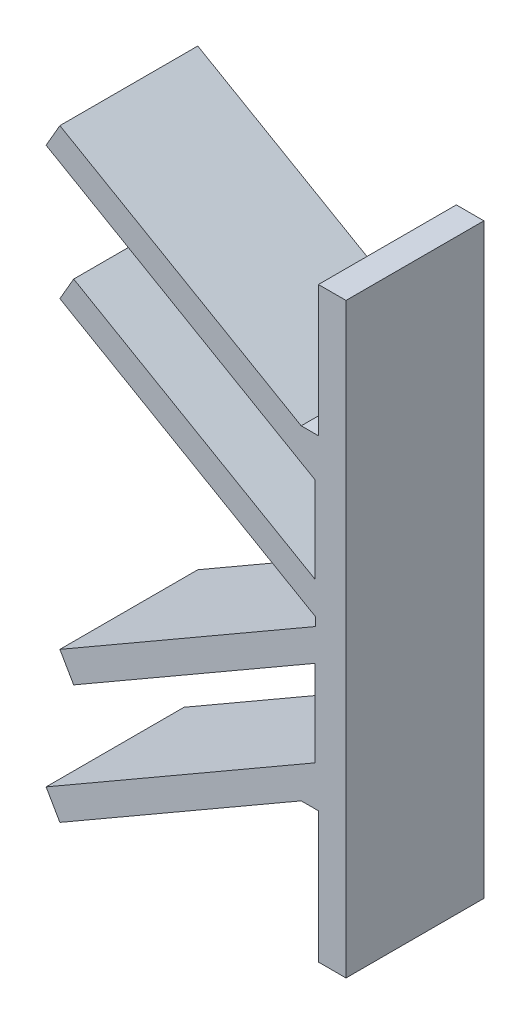
ISO-10303-21;
HEADER;
FILE_DESCRIPTION(('STEP AP214'),'2;1');
FILE_NAME('part.step','',(''),(''),'','','');
FILE_SCHEMA(('AUTOMOTIVE_DESIGN { 1 0 10303 214 1 1 1 1 }'));
ENDSEC;
DATA;
#1=APPLICATION_CONTEXT('core data for automotive mechanical design processes');
#2=APPLICATION_PROTOCOL_DEFINITION('international standard','automotive_design',2000,#1);
#3=PRODUCT_CONTEXT('',#1,'mechanical');
#4=PRODUCT('Part','Part','',(#3));
#5=PRODUCT_RELATED_PRODUCT_CATEGORY('part','',(#4));
#6=PRODUCT_DEFINITION_FORMATION('','',#4);
#7=PRODUCT_DEFINITION_CONTEXT('part definition',#1,'design');
#8=PRODUCT_DEFINITION('design','',#6,#7);
#9=PRODUCT_DEFINITION_SHAPE('','',#8);
#10=(LENGTH_UNIT() NAMED_UNIT(*) SI_UNIT(.MILLI.,.METRE.));
#11=(NAMED_UNIT(*) PLANE_ANGLE_UNIT() SI_UNIT($,.RADIAN.));
#12=(NAMED_UNIT(*) SI_UNIT($,.STERADIAN.) SOLID_ANGLE_UNIT());
#13=UNCERTAINTY_MEASURE_WITH_UNIT(LENGTH_MEASURE(1.E-05),#10,'distance_accuracy_value','');
#14=(GEOMETRIC_REPRESENTATION_CONTEXT(3) GLOBAL_UNCERTAINTY_ASSIGNED_CONTEXT((#13)) GLOBAL_UNIT_ASSIGNED_CONTEXT((#10,
#11,#12)) REPRESENTATION_CONTEXT('',''));
#15=CARTESIAN_POINT('',(0.,0.,0.));
#16=DIRECTION('',(0.,0.,1.));
#17=DIRECTION('',(1.,0.,0.));
#18=AXIS2_PLACEMENT_3D('',#15,#16,#17);
#19=CARTESIAN_POINT('',(1.8,17.444065895807,8.));
#20=DIRECTION('',(-1.,0.,0.));
#21=DIRECTION('',(0.,0.,1.));
#22=AXIS2_PLACEMENT_3D('',#19,#20,#21);
#23=PLANE('',#22);
#24=DIRECTION('',(0.,1.,0.));
#25=VECTOR('',#24,1.);
#26=CARTESIAN_POINT('',(1.8,17.444065895807,0.));
#27=LINE('',#26,#25);
#28=CARTESIAN_POINT('',(1.8,-16.6,0.));
#29=VERTEX_POINT('',#28);
#30=CARTESIAN_POINT('',(1.8,17.444065895807,0.));
#31=VERTEX_POINT('',#30);
#32=EDGE_CURVE('E131',#29,#31,#27,.T.);
#33=ORIENTED_EDGE('',*,*,#32,.T.);
#34=DIRECTION('',(0.,0.,-1.));
#35=VECTOR('',#34,1.);
#36=CARTESIAN_POINT('',(1.8,17.444065895807,8.));
#37=LINE('',#36,#35);
#38=CARTESIAN_POINT('',(1.8,17.444065895807,8.));
#39=VERTEX_POINT('',#38);
#40=EDGE_CURVE('E11',#39,#31,#37,.T.);
#41=ORIENTED_EDGE('',*,*,#40,.F.);
#42=DIRECTION('',(0.,1.,0.));
#43=VECTOR('',#42,1.);
#44=CARTESIAN_POINT('',(1.8,-16.6,8.));
#45=LINE('',#44,#43);
#46=CARTESIAN_POINT('',(1.8,-16.6,8.));
#47=VERTEX_POINT('',#46);
#48=EDGE_CURVE('E139',#47,#39,#45,.T.);
#49=ORIENTED_EDGE('',*,*,#48,.F.);
#50=DIRECTION('',(0.,0.,-1.));
#51=VECTOR('',#50,1.);
#52=CARTESIAN_POINT('',(1.8,-16.6,8.));
#53=LINE('',#52,#51);
#54=EDGE_CURVE('E214',#47,#29,#53,.T.);
#55=ORIENTED_EDGE('',*,*,#54,.T.);
#56=EDGE_LOOP('',(#33,#41,#49,#55));
#57=FACE_BOUND('',#56,.T.);
#58=ADVANCED_FACE('F39',(#57),#23,.F.);
#59=CARTESIAN_POINT('',(0.199999999999989,17.444065895807,8.));
#60=DIRECTION('',(0.,-1.,0.));
#61=DIRECTION('',(0.,0.,-1.));
#62=AXIS2_PLACEMENT_3D('',#59,#60,#61);
#63=PLANE('',#62);
#64=DIRECTION('',(-1.,0.,0.));
#65=VECTOR('',#64,1.);
#66=CARTESIAN_POINT('',(0.199999999999989,17.444065895807,0.));
#67=LINE('',#66,#65);
#68=CARTESIAN_POINT('',(0.199999999999989,17.444065895807,0.));
#69=VERTEX_POINT('',#68);
#70=EDGE_CURVE('E219',#31,#69,#67,.T.);
#71=ORIENTED_EDGE('',*,*,#70,.T.);
#72=DIRECTION('',(0.,0.,-1.));
#73=VECTOR('',#72,1.);
#74=CARTESIAN_POINT('',(0.199999999999989,17.444065895807,8.));
#75=LINE('',#74,#73);
#76=CARTESIAN_POINT('',(0.199999999999989,17.444065895807,8.));
#77=VERTEX_POINT('',#76);
#78=EDGE_CURVE('E50',#77,#69,#75,.T.);
#79=ORIENTED_EDGE('',*,*,#78,.F.);
#80=DIRECTION('',(-1.,0.,0.));
#81=VECTOR('',#80,1.);
#82=CARTESIAN_POINT('',(0.199999999999989,17.444065895807,8.));
#83=LINE('',#82,#81);
#84=EDGE_CURVE('E379',#39,#77,#83,.T.);
#85=ORIENTED_EDGE('',*,*,#84,.F.);
#86=ORIENTED_EDGE('',*,*,#40,.T.);
#87=EDGE_LOOP('',(#71,#79,#85,#86));
#88=FACE_BOUND('',#87,.T.);
#89=ADVANCED_FACE('F382',(#88),#63,.F.);
#90=CARTESIAN_POINT('',(0.199999999999989,17.444065895807,8.));
#91=DIRECTION('',(1.,0.,0.));
#92=DIRECTION('',(0.,1.,0.));
#93=AXIS2_PLACEMENT_3D('',#90,#91,#92);
#94=PLANE('',#93);
#95=DIRECTION('',(0.,-1.,0.));
#96=VECTOR('',#95,1.);
#97=CARTESIAN_POINT('',(0.199999999999989,17.444065895807,0.));
#98=LINE('',#97,#96);
#99=CARTESIAN_POINT('',(0.199999999999982,9.84406589580699,0.));
#100=VERTEX_POINT('',#99);
#101=EDGE_CURVE('E225',#69,#100,#98,.T.);
#102=ORIENTED_EDGE('',*,*,#101,.T.);
#103=DIRECTION('',(0.,0.,-1.));
#104=VECTOR('',#103,1.);
#105=CARTESIAN_POINT('',(0.199999999999982,9.84406589580699,8.));
#106=LINE('',#105,#104);
#107=CARTESIAN_POINT('',(0.199999999999982,9.84406589580699,8.));
#108=VERTEX_POINT('',#107);
#109=EDGE_CURVE('E313',#108,#100,#106,.T.);
#110=ORIENTED_EDGE('',*,*,#109,.F.);
#111=DIRECTION('',(0.,-1.,0.));
#112=VECTOR('',#111,1.);
#113=CARTESIAN_POINT('',(0.199999999999989,17.444065895807,8.));
#114=LINE('',#113,#112);
#115=EDGE_CURVE('E319',#77,#108,#114,.T.);
#116=ORIENTED_EDGE('',*,*,#115,.F.);
#117=ORIENTED_EDGE('',*,*,#78,.T.);
#118=EDGE_LOOP('',(#102,#110,#116,#117));
#119=FACE_BOUND('',#118,.T.);
#120=ADVANCED_FACE('F318',(#119),#94,.F.);
#121=CARTESIAN_POINT('',(0.199999999999982,9.84406589580699,8.));
#122=DIRECTION('',(0.,-1.,0.));
#123=DIRECTION('',(0.,0.,-1.));
#124=AXIS2_PLACEMENT_3D('',#121,#122,#123);
#125=PLANE('',#124);
#126=DIRECTION('',(-1.,0.,0.));
#127=VECTOR('',#126,1.);
#128=CARTESIAN_POINT('',(0.199999999999982,9.84406589580699,0.));
#129=LINE('',#128,#127);
#130=CARTESIAN_POINT('',(-0.800000000000016,9.84406589580699,0.));
#131=VERTEX_POINT('',#130);
#132=EDGE_CURVE('E221',#100,#131,#129,.T.);
#133=ORIENTED_EDGE('',*,*,#132,.T.);
#134=DIRECTION('',(0.,0.,-1.));
#135=VECTOR('',#134,1.);
#136=CARTESIAN_POINT('',(-0.800000000000016,9.84406589580699,8.));
#137=LINE('',#136,#135);
#138=CARTESIAN_POINT('',(-0.800000000000016,9.84406589580699,8.));
#139=VERTEX_POINT('',#138);
#140=EDGE_CURVE('E306',#139,#131,#137,.T.);
#141=ORIENTED_EDGE('',*,*,#140,.F.);
#142=DIRECTION('',(-1.,0.,0.));
#143=VECTOR('',#142,1.);
#144=CARTESIAN_POINT('',(0.199999999999982,9.84406589580699,8.));
#145=LINE('',#144,#143);
#146=EDGE_CURVE('E336',#108,#139,#145,.T.);
#147=ORIENTED_EDGE('',*,*,#146,.F.);
#148=ORIENTED_EDGE('',*,*,#109,.T.);
#149=EDGE_LOOP('',(#133,#141,#147,#148));
#150=FACE_BOUND('',#149,.T.);
#151=ADVANCED_FACE('F328',(#150),#125,.F.);
#152=CARTESIAN_POINT('',(-0.800000000000016,9.84406589580699,8.));
#153=DIRECTION('',(-0.499999999999998,-0.86602540378444,0.));
#154=DIRECTION('',(0.86602540378444,-0.499999999999998,0.));
#155=AXIS2_PLACEMENT_3D('',#152,#153,#154);
#156=PLANE('',#155);
#157=DIRECTION('',(-0.86602540378444,0.499999999999998,0.));
#158=VECTOR('',#157,1.);
#159=CARTESIAN_POINT('',(-0.800000000000016,9.84406589580699,0.));
#160=LINE('',#159,#158);
#161=CARTESIAN_POINT('',(-14.8,17.9269696644617,0.));
#162=VERTEX_POINT('',#161);
#163=EDGE_CURVE('E228',#131,#162,#160,.T.);
#164=ORIENTED_EDGE('',*,*,#163,.T.);
#165=DIRECTION('',(0.,0.,-1.));
#166=VECTOR('',#165,1.);
#167=CARTESIAN_POINT('',(-14.8,17.9269696644617,8.));
#168=LINE('',#167,#166);
#169=CARTESIAN_POINT('',(-14.8,17.9269696644617,8.));
#170=VERTEX_POINT('',#169);
#171=EDGE_CURVE('E302',#170,#162,#168,.T.);
#172=ORIENTED_EDGE('',*,*,#171,.F.);
#173=DIRECTION('',(-0.86602540378444,0.499999999999998,0.));
#174=VECTOR('',#173,1.);
#175=CARTESIAN_POINT('',(-0.800000000000016,9.84406589580699,8.));
#176=LINE('',#175,#174);
#177=EDGE_CURVE('E333',#139,#170,#176,.T.);
#178=ORIENTED_EDGE('',*,*,#177,.F.);
#179=ORIENTED_EDGE('',*,*,#140,.T.);
#180=EDGE_LOOP('',(#164,#172,#178,#179));
#181=FACE_BOUND('',#180,.T.);
#182=ADVANCED_FACE('F334',(#181),#156,.F.);
#183=CARTESIAN_POINT('',(-14.8,17.9269696644617,8.));
#184=DIRECTION('',(0.866025403784441,-0.499999999999995,0.));
#185=DIRECTION('',(0.499999999999995,0.866025403784441,0.));
#186=AXIS2_PLACEMENT_3D('',#183,#184,#185);
#187=PLANE('',#186);
#188=DIRECTION('',(-0.499999999999995,-0.866025403784441,0.));
#189=VECTOR('',#188,1.);
#190=CARTESIAN_POINT('',(-14.8,17.9269696644617,0.));
#191=LINE('',#190,#189);
#192=CARTESIAN_POINT('',(-15.6,16.5413290184066,0.));
#193=VERTEX_POINT('',#192);
#194=EDGE_CURVE('E226',#162,#193,#191,.T.);
#195=ORIENTED_EDGE('',*,*,#194,.T.);
#196=DIRECTION('',(0.,0.,-1.));
#197=VECTOR('',#196,1.);
#198=CARTESIAN_POINT('',(-15.6,16.5413290184066,8.));
#199=LINE('',#198,#197);
#200=CARTESIAN_POINT('',(-15.6,16.5413290184066,8.));
#201=VERTEX_POINT('',#200);
#202=EDGE_CURVE('E305',#201,#193,#199,.T.);
#203=ORIENTED_EDGE('',*,*,#202,.F.);
#204=DIRECTION('',(-0.499999999999995,-0.866025403784441,0.));
#205=VECTOR('',#204,1.);
#206=CARTESIAN_POINT('',(-14.8,17.9269696644617,8.));
#207=LINE('',#206,#205);
#208=EDGE_CURVE('E340',#170,#201,#207,.T.);
#209=ORIENTED_EDGE('',*,*,#208,.F.);
#210=ORIENTED_EDGE('',*,*,#171,.T.);
#211=EDGE_LOOP('',(#195,#203,#209,#210));
#212=FACE_BOUND('',#211,.T.);
#213=ADVANCED_FACE('F394',(#212),#187,.F.);
#214=CARTESIAN_POINT('',(-15.6,16.5413290184066,8.));
#215=DIRECTION('',(0.499999999999999,0.866025403784439,0.));
#216=DIRECTION('',(-0.86602540378444,0.499999999999999,0.));
#217=AXIS2_PLACEMENT_3D('',#214,#215,#216);
#218=PLANE('',#217);
#219=DIRECTION('',(0.86602540378444,-0.499999999999999,0.));
#220=VECTOR('',#219,1.);
#221=CARTESIAN_POINT('',(-15.6,16.5413290184066,0.));
#222=LINE('',#221,#220);
#223=CARTESIAN_POINT('',(0.,7.53466481904848,0.));
#224=VERTEX_POINT('',#223);
#225=EDGE_CURVE('E229',#193,#224,#222,.T.);
#226=ORIENTED_EDGE('',*,*,#225,.T.);
#227=DIRECTION('',(0.,0.,-1.));
#228=VECTOR('',#227,1.);
#229=CARTESIAN_POINT('',(0.,7.53466481904848,8.));
#230=LINE('',#229,#228);
#231=CARTESIAN_POINT('',(0.,7.53466481904848,8.));
#232=VERTEX_POINT('',#231);
#233=EDGE_CURVE('E297',#232,#224,#230,.T.);
#234=ORIENTED_EDGE('',*,*,#233,.F.);
#235=DIRECTION('',(0.86602540378444,-0.499999999999999,0.));
#236=VECTOR('',#235,1.);
#237=CARTESIAN_POINT('',(-15.6,16.5413290184066,8.));
#238=LINE('',#237,#236);
#239=EDGE_CURVE('E339',#201,#232,#238,.T.);
#240=ORIENTED_EDGE('',*,*,#239,.F.);
#241=ORIENTED_EDGE('',*,*,#202,.T.);
#242=EDGE_LOOP('',(#226,#234,#240,#241));
#243=FACE_BOUND('',#242,.T.);
#244=ADVANCED_FACE('F396',(#243),#218,.F.);
#245=CARTESIAN_POINT('',(0.,7.53466481904848,8.));
#246=DIRECTION('',(1.,0.,0.));
#247=DIRECTION('',(0.,1.,0.));
#248=AXIS2_PLACEMENT_3D('',#245,#246,#247);
#249=PLANE('',#248);
#250=DIRECTION('',(0.,-1.,0.));
#251=VECTOR('',#250,1.);
#252=CARTESIAN_POINT('',(0.,7.53466481904848,0.));
#253=LINE('',#252,#251);
#254=CARTESIAN_POINT('',(0.,2.53466481904848,0.));
#255=VERTEX_POINT('',#254);
#256=EDGE_CURVE('E235',#224,#255,#253,.T.);
#257=ORIENTED_EDGE('',*,*,#256,.T.);
#258=DIRECTION('',(0.,0.,-1.));
#259=VECTOR('',#258,1.);
#260=CARTESIAN_POINT('',(0.,2.53466481904848,8.));
#261=LINE('',#260,#259);
#262=CARTESIAN_POINT('',(0.,2.53466481904848,8.));
#263=VERTEX_POINT('',#262);
#264=EDGE_CURVE('E298',#263,#255,#261,.T.);
#265=ORIENTED_EDGE('',*,*,#264,.F.);
#266=DIRECTION('',(0.,-1.,0.));
#267=VECTOR('',#266,1.);
#268=CARTESIAN_POINT('',(0.,7.53466481904848,8.));
#269=LINE('',#268,#267);
#270=EDGE_CURVE('E347',#232,#263,#269,.T.);
#271=ORIENTED_EDGE('',*,*,#270,.F.);
#272=ORIENTED_EDGE('',*,*,#233,.T.);
#273=EDGE_LOOP('',(#257,#265,#271,#272));
#274=FACE_BOUND('',#273,.T.);
#275=ADVANCED_FACE('F405',(#274),#249,.F.);
#276=CARTESIAN_POINT('',(0.,2.53466481904848,8.));
#277=DIRECTION('',(-0.499999999999999,-0.866025403784439,0.));
#278=DIRECTION('',(0.866025403784439,-0.499999999999999,0.));
#279=AXIS2_PLACEMENT_3D('',#276,#277,#278);
#280=PLANE('',#279);
#281=DIRECTION('',(-0.866025403784439,0.499999999999999,0.));
#282=VECTOR('',#281,1.);
#283=CARTESIAN_POINT('',(0.,2.53466481904848,0.));
#284=LINE('',#283,#282);
#285=CARTESIAN_POINT('',(-14.,10.6175685877032,0.));
#286=VERTEX_POINT('',#285);
#287=EDGE_CURVE('E234',#255,#286,#284,.T.);
#288=ORIENTED_EDGE('',*,*,#287,.T.);
#289=DIRECTION('',(0.,0.,-1.));
#290=VECTOR('',#289,1.);
#291=CARTESIAN_POINT('',(-14.,10.6175685877032,8.));
#292=LINE('',#291,#290);
#293=CARTESIAN_POINT('',(-14.,10.6175685877032,8.));
#294=VERTEX_POINT('',#293);
#295=EDGE_CURVE('E291',#294,#286,#292,.T.);
#296=ORIENTED_EDGE('',*,*,#295,.F.);
#297=DIRECTION('',(-0.866025403784439,0.499999999999999,0.));
#298=VECTOR('',#297,1.);
#299=CARTESIAN_POINT('',(0.,2.53466481904848,8.));
#300=LINE('',#299,#298);
#301=EDGE_CURVE('E346',#263,#294,#300,.T.);
#302=ORIENTED_EDGE('',*,*,#301,.F.);
#303=ORIENTED_EDGE('',*,*,#264,.T.);
#304=EDGE_LOOP('',(#288,#296,#302,#303));
#305=FACE_BOUND('',#304,.T.);
#306=ADVANCED_FACE('F408',(#305),#280,.F.);
#307=CARTESIAN_POINT('',(-14.,10.6175685877032,8.));
#308=DIRECTION('',(0.866025403784439,-0.499999999999999,0.));
#309=DIRECTION('',(0.499999999999999,0.866025403784439,0.));
#310=AXIS2_PLACEMENT_3D('',#307,#308,#309);
#311=PLANE('',#310);
#312=DIRECTION('',(-0.499999999999999,-0.866025403784439,0.));
#313=VECTOR('',#312,1.);
#314=CARTESIAN_POINT('',(-14.,10.6175685877032,0.));
#315=LINE('',#314,#313);
#316=CARTESIAN_POINT('',(-14.8,9.23192794164811,0.));
#317=VERTEX_POINT('',#316);
#318=EDGE_CURVE('E237',#286,#317,#315,.T.);
#319=ORIENTED_EDGE('',*,*,#318,.T.);
#320=DIRECTION('',(0.,0.,-1.));
#321=VECTOR('',#320,1.);
#322=CARTESIAN_POINT('',(-14.8,9.23192794164811,8.));
#323=LINE('',#322,#321);
#324=CARTESIAN_POINT('',(-14.8,9.23192794164811,8.));
#325=VERTEX_POINT('',#324);
#326=EDGE_CURVE('E287',#325,#317,#323,.T.);
#327=ORIENTED_EDGE('',*,*,#326,.F.);
#328=DIRECTION('',(-0.499999999999999,-0.866025403784439,0.));
#329=VECTOR('',#328,1.);
#330=CARTESIAN_POINT('',(-14.,10.6175685877032,8.));
#331=LINE('',#330,#329);
#332=EDGE_CURVE('E348',#294,#325,#331,.T.);
#333=ORIENTED_EDGE('',*,*,#332,.F.);
#334=ORIENTED_EDGE('',*,*,#295,.T.);
#335=EDGE_LOOP('',(#319,#327,#333,#334));
#336=FACE_BOUND('',#335,.T.);
#337=ADVANCED_FACE('F409',(#336),#311,.F.);
#338=CARTESIAN_POINT('',(-14.0168684713036,8.77978674274434,8.));
#339=DIRECTION('',(0.499999999999999,0.866025403784439,0.));
#340=DIRECTION('',(-0.866025403784439,0.499999999999999,0.));
#341=AXIS2_PLACEMENT_3D('',#338,#339,#340);
#342=PLANE('',#341);
#343=DIRECTION('',(0.866025403784439,-0.499999999999999,0.));
#344=VECTOR('',#343,1.);
#345=CARTESIAN_POINT('',(-14.0168684713036,8.77978674274434,0.));
#346=LINE('',#345,#344);
#347=CARTESIAN_POINT('',(0.0261730366202076,0.672032947903492,0.));
#348=VERTEX_POINT('',#347);
#349=EDGE_CURVE('E239',#317,#348,#346,.T.);
#350=ORIENTED_EDGE('',*,*,#349,.T.);
#351=DIRECTION('',(0.,0.,-1.));
#352=VECTOR('',#351,1.);
#353=CARTESIAN_POINT('',(0.0261730366202076,0.672032947903492,8.));
#354=LINE('',#353,#352);
#355=CARTESIAN_POINT('',(0.0261730366202076,0.672032947903492,8.));
#356=VERTEX_POINT('',#355);
#357=EDGE_CURVE('E290',#356,#348,#354,.T.);
#358=ORIENTED_EDGE('',*,*,#357,.F.);
#359=DIRECTION('',(0.866025403784441,-0.499999999999996,0.));
#360=VECTOR('',#359,1.);
#361=CARTESIAN_POINT('',(-14.8,9.23192794164811,8.));
#362=LINE('',#361,#360);
#363=EDGE_CURVE('E355',#325,#356,#362,.T.);
#364=ORIENTED_EDGE('',*,*,#363,.F.);
#365=ORIENTED_EDGE('',*,*,#326,.T.);
#366=EDGE_LOOP('',(#350,#358,#364,#365));
#367=FACE_BOUND('',#366,.T.);
#368=ADVANCED_FACE('F414',(#367),#342,.F.);
#369=CARTESIAN_POINT('',(0.0261730366202077,0.172032947903492,8.));
#370=DIRECTION('',(1.,0.,0.));
#371=DIRECTION('',(0.,1.,0.));
#372=AXIS2_PLACEMENT_3D('',#369,#370,#371);
#373=PLANE('',#372);
#374=DIRECTION('',(0.,-1.,0.));
#375=VECTOR('',#374,1.);
#376=CARTESIAN_POINT('',(0.0261730366202077,0.172032947903492,0.));
#377=LINE('',#376,#375);
#378=CARTESIAN_POINT('',(0.0261730366202077,0.172032947903492,0.));
#379=VERTEX_POINT('',#378);
#380=EDGE_CURVE('E243',#348,#379,#377,.T.);
#381=ORIENTED_EDGE('',*,*,#380,.T.);
#382=DIRECTION('',(0.,0.,-1.));
#383=VECTOR('',#382,1.);
#384=CARTESIAN_POINT('',(0.0261730366202077,0.172032947903492,8.));
#385=LINE('',#384,#383);
#386=CARTESIAN_POINT('',(0.0261730366202077,0.172032947903492,8.));
#387=VERTEX_POINT('',#386);
#388=EDGE_CURVE('E282',#387,#379,#385,.T.);
#389=ORIENTED_EDGE('',*,*,#388,.F.);
#390=DIRECTION('',(0.,-1.,0.));
#391=VECTOR('',#390,1.);
#392=CARTESIAN_POINT('',(0.0261730366202077,0.172032947903492,8.));
#393=LINE('',#392,#391);
#394=EDGE_CURVE('E352',#356,#387,#393,.T.);
#395=ORIENTED_EDGE('',*,*,#394,.F.);
#396=ORIENTED_EDGE('',*,*,#357,.T.);
#397=EDGE_LOOP('',(#381,#389,#395,#396));
#398=FACE_BOUND('',#397,.T.);
#399=ADVANCED_FACE('F416',(#398),#373,.F.);
#400=CARTESIAN_POINT('',(-14.8,-8.38786204584115,8.));
#401=DIRECTION('',(0.5,-0.866025403784439,0.));
#402=DIRECTION('',(0.866025403784438,0.5,0.));
#403=AXIS2_PLACEMENT_3D('',#400,#401,#402);
#404=PLANE('',#403);
#405=DIRECTION('',(-0.866025403784438,-0.5,0.));
#406=VECTOR('',#405,1.);
#407=CARTESIAN_POINT('',(-14.8,-8.38786204584115,0.));
#408=LINE('',#407,#406);
#409=CARTESIAN_POINT('',(-14.8,-8.38786204584115,0.));
#410=VERTEX_POINT('',#409);
#411=EDGE_CURVE('E242',#379,#410,#408,.T.);
#412=ORIENTED_EDGE('',*,*,#411,.T.);
#413=DIRECTION('',(0.,0.,-1.));
#414=VECTOR('',#413,1.);
#415=CARTESIAN_POINT('',(-14.8,-8.38786204584115,8.));
#416=LINE('',#415,#414);
#417=CARTESIAN_POINT('',(-14.8,-8.38786204584115,8.));
#418=VERTEX_POINT('',#417);
#419=EDGE_CURVE('E283',#418,#410,#416,.T.);
#420=ORIENTED_EDGE('',*,*,#419,.F.);
#421=DIRECTION('',(-0.866025403784439,-0.5,0.));
#422=VECTOR('',#421,1.);
#423=CARTESIAN_POINT('',(-14.0168684713036,-7.93572084693738,8.));
#424=LINE('',#423,#422);
#425=EDGE_CURVE('E358',#387,#418,#424,.T.);
#426=ORIENTED_EDGE('',*,*,#425,.F.);
#427=ORIENTED_EDGE('',*,*,#388,.T.);
#428=EDGE_LOOP('',(#412,#420,#426,#427));
#429=FACE_BOUND('',#428,.T.);
#430=ADVANCED_FACE('F425',(#429),#404,.F.);
#431=CARTESIAN_POINT('',(-14.,-9.77350269189625,8.));
#432=DIRECTION('',(0.866025403784439,0.5,0.));
#433=DIRECTION('',(-0.5,0.866025403784439,0.));
#434=AXIS2_PLACEMENT_3D('',#431,#432,#433);
#435=PLANE('',#434);
#436=DIRECTION('',(0.5,-0.866025403784439,0.));
#437=VECTOR('',#436,1.);
#438=CARTESIAN_POINT('',(-14.,-9.77350269189625,0.));
#439=LINE('',#438,#437);
#440=CARTESIAN_POINT('',(-14.,-9.77350269189625,0.));
#441=VERTEX_POINT('',#440);
#442=EDGE_CURVE('E248',#410,#441,#439,.T.);
#443=ORIENTED_EDGE('',*,*,#442,.T.);
#444=DIRECTION('',(0.,0.,-1.));
#445=VECTOR('',#444,1.);
#446=CARTESIAN_POINT('',(-14.,-9.77350269189625,8.));
#447=LINE('',#446,#445);
#448=CARTESIAN_POINT('',(-14.,-9.77350269189625,8.));
#449=VERTEX_POINT('',#448);
#450=EDGE_CURVE('E279',#449,#441,#447,.T.);
#451=ORIENTED_EDGE('',*,*,#450,.F.);
#452=DIRECTION('',(0.5,-0.866025403784439,0.));
#453=VECTOR('',#452,1.);
#454=CARTESIAN_POINT('',(-14.,-9.77350269189625,8.));
#455=LINE('',#454,#453);
#456=EDGE_CURVE('E356',#418,#449,#455,.T.);
#457=ORIENTED_EDGE('',*,*,#456,.F.);
#458=ORIENTED_EDGE('',*,*,#419,.T.);
#459=EDGE_LOOP('',(#443,#451,#457,#458));
#460=FACE_BOUND('',#459,.T.);
#461=ADVANCED_FACE('F426',(#460),#435,.F.);
#462=CARTESIAN_POINT('',(0.,-1.6905989232415,8.));
#463=DIRECTION('',(-0.5,0.866025403784439,0.));
#464=DIRECTION('',(-0.866025403784439,-0.5,0.));
#465=AXIS2_PLACEMENT_3D('',#462,#463,#464);
#466=PLANE('',#465);
#467=DIRECTION('',(0.866025403784439,0.5,0.));
#468=VECTOR('',#467,1.);
#469=CARTESIAN_POINT('',(0.,-1.6905989232415,0.));
#470=LINE('',#469,#468);
#471=CARTESIAN_POINT('',(0.,-1.6905989232415,0.));
#472=VERTEX_POINT('',#471);
#473=EDGE_CURVE('E246',#441,#472,#470,.T.);
#474=ORIENTED_EDGE('',*,*,#473,.T.);
#475=DIRECTION('',(0.,0.,-1.));
#476=VECTOR('',#475,1.);
#477=CARTESIAN_POINT('',(0.,-1.6905989232415,8.));
#478=LINE('',#477,#476);
#479=CARTESIAN_POINT('',(0.,-1.6905989232415,8.));
#480=VERTEX_POINT('',#479);
#481=EDGE_CURVE('E274',#480,#472,#478,.T.);
#482=ORIENTED_EDGE('',*,*,#481,.F.);
#483=DIRECTION('',(0.866025403784439,0.5,0.));
#484=VECTOR('',#483,1.);
#485=CARTESIAN_POINT('',(0.,-1.6905989232415,8.));
#486=LINE('',#485,#484);
#487=EDGE_CURVE('E357',#449,#480,#486,.T.);
#488=ORIENTED_EDGE('',*,*,#487,.F.);
#489=ORIENTED_EDGE('',*,*,#450,.T.);
#490=EDGE_LOOP('',(#474,#482,#488,#489));
#491=FACE_BOUND('',#490,.T.);
#492=ADVANCED_FACE('F429',(#491),#466,.F.);
#493=CARTESIAN_POINT('',(0.,-6.6905989232415,8.));
#494=DIRECTION('',(1.,0.,0.));
#495=DIRECTION('',(0.,0.,-1.));
#496=AXIS2_PLACEMENT_3D('',#493,#494,#495);
#497=PLANE('',#496);
#498=DIRECTION('',(0.,-1.,0.));
#499=VECTOR('',#498,1.);
#500=CARTESIAN_POINT('',(0.,-6.6905989232415,0.));
#501=LINE('',#500,#499);
#502=CARTESIAN_POINT('',(0.,-6.6905989232415,0.));
#503=VERTEX_POINT('',#502);
#504=EDGE_CURVE('E247',#472,#503,#501,.T.);
#505=ORIENTED_EDGE('',*,*,#504,.T.);
#506=DIRECTION('',(0.,0.,-1.));
#507=VECTOR('',#506,1.);
#508=CARTESIAN_POINT('',(0.,-6.6905989232415,8.));
#509=LINE('',#508,#507);
#510=CARTESIAN_POINT('',(0.,-6.6905989232415,8.));
#511=VERTEX_POINT('',#510);
#512=EDGE_CURVE('E275',#511,#503,#509,.T.);
#513=ORIENTED_EDGE('',*,*,#512,.F.);
#514=DIRECTION('',(0.,-1.,0.));
#515=VECTOR('',#514,1.);
#516=CARTESIAN_POINT('',(0.,-6.6905989232415,8.));
#517=LINE('',#516,#515);
#518=EDGE_CURVE('E362',#480,#511,#517,.T.);
#519=ORIENTED_EDGE('',*,*,#518,.F.);
#520=ORIENTED_EDGE('',*,*,#481,.T.);
#521=EDGE_LOOP('',(#505,#513,#519,#520));
#522=FACE_BOUND('',#521,.T.);
#523=ADVANCED_FACE('F432',(#522),#497,.F.);
#524=CARTESIAN_POINT('',(-15.6,-15.6972631225997,8.));
#525=DIRECTION('',(0.5,-0.866025403784439,0.));
#526=DIRECTION('',(0.866025403784439,0.5,0.));
#527=AXIS2_PLACEMENT_3D('',#524,#525,#526);
#528=PLANE('',#527);
#529=DIRECTION('',(-0.866025403784439,-0.5,0.));
#530=VECTOR('',#529,1.);
#531=CARTESIAN_POINT('',(-15.6,-15.6972631225997,0.));
#532=LINE('',#531,#530);
#533=CARTESIAN_POINT('',(-15.6,-15.6972631225997,0.));
#534=VERTEX_POINT('',#533);
#535=EDGE_CURVE('E252',#503,#534,#532,.T.);
#536=ORIENTED_EDGE('',*,*,#535,.T.);
#537=DIRECTION('',(0.,0.,-1.));
#538=VECTOR('',#537,1.);
#539=CARTESIAN_POINT('',(-15.6,-15.6972631225997,8.));
#540=LINE('',#539,#538);
#541=CARTESIAN_POINT('',(-15.6,-15.6972631225997,8.));
#542=VERTEX_POINT('',#541);
#543=EDGE_CURVE('E267',#542,#534,#540,.T.);
#544=ORIENTED_EDGE('',*,*,#543,.F.);
#545=DIRECTION('',(-0.866025403784439,-0.5,0.));
#546=VECTOR('',#545,1.);
#547=CARTESIAN_POINT('',(-15.6,-15.6972631225997,8.));
#548=LINE('',#547,#546);
#549=EDGE_CURVE('E365',#511,#542,#548,.T.);
#550=ORIENTED_EDGE('',*,*,#549,.F.);
#551=ORIENTED_EDGE('',*,*,#512,.T.);
#552=EDGE_LOOP('',(#536,#544,#550,#551));
#553=FACE_BOUND('',#552,.T.);
#554=ADVANCED_FACE('F437',(#553),#528,.F.);
#555=CARTESIAN_POINT('',(-14.8,-17.0829037686548,8.));
#556=DIRECTION('',(0.866025403784439,0.5,0.));
#557=DIRECTION('',(-0.5,0.866025403784439,0.));
#558=AXIS2_PLACEMENT_3D('',#555,#556,#557);
#559=PLANE('',#558);
#560=DIRECTION('',(0.5,-0.866025403784439,0.));
#561=VECTOR('',#560,1.);
#562=CARTESIAN_POINT('',(-14.8,-17.0829037686548,0.));
#563=LINE('',#562,#561);
#564=CARTESIAN_POINT('',(-14.8,-17.0829037686548,0.));
#565=VERTEX_POINT('',#564);
#566=EDGE_CURVE('E255',#534,#565,#563,.T.);
#567=ORIENTED_EDGE('',*,*,#566,.T.);
#568=DIRECTION('',(0.,0.,-1.));
#569=VECTOR('',#568,1.);
#570=CARTESIAN_POINT('',(-14.8,-17.0829037686548,8.));
#571=LINE('',#570,#569);
#572=CARTESIAN_POINT('',(-14.8,-17.0829037686548,8.));
#573=VERTEX_POINT('',#572);
#574=EDGE_CURVE('E266',#573,#565,#571,.T.);
#575=ORIENTED_EDGE('',*,*,#574,.F.);
#576=DIRECTION('',(0.5,-0.866025403784439,0.));
#577=VECTOR('',#576,1.);
#578=CARTESIAN_POINT('',(-14.8,-17.0829037686548,8.));
#579=LINE('',#578,#577);
#580=EDGE_CURVE('E368',#542,#573,#579,.T.);
#581=ORIENTED_EDGE('',*,*,#580,.F.);
#582=ORIENTED_EDGE('',*,*,#543,.T.);
#583=EDGE_LOOP('',(#567,#575,#581,#582));
#584=FACE_BOUND('',#583,.T.);
#585=ADVANCED_FACE('F375',(#584),#559,.F.);
#586=CARTESIAN_POINT('',(-0.8,-9.00000000000001,8.));
#587=DIRECTION('',(-0.5,0.866025403784439,0.));
#588=DIRECTION('',(-0.866025403784439,-0.5,0.));
#589=AXIS2_PLACEMENT_3D('',#586,#587,#588);
#590=PLANE('',#589);
#591=DIRECTION('',(0.866025403784439,0.5,0.));
#592=VECTOR('',#591,1.);
#593=CARTESIAN_POINT('',(-0.8,-9.00000000000001,0.));
#594=LINE('',#593,#592);
#595=CARTESIAN_POINT('',(-0.8,-9.00000000000001,0.));
#596=VERTEX_POINT('',#595);
#597=EDGE_CURVE('E258',#565,#596,#594,.T.);
#598=ORIENTED_EDGE('',*,*,#597,.T.);
#599=DIRECTION('',(0.,0.,-1.));
#600=VECTOR('',#599,1.);
#601=CARTESIAN_POINT('',(-0.8,-9.00000000000001,8.));
#602=LINE('',#601,#600);
#603=CARTESIAN_POINT('',(-0.8,-9.00000000000001,8.));
#604=VERTEX_POINT('',#603);
#605=EDGE_CURVE('E209',#604,#596,#602,.T.);
#606=ORIENTED_EDGE('',*,*,#605,.F.);
#607=DIRECTION('',(0.866025403784439,0.5,0.));
#608=VECTOR('',#607,1.);
#609=CARTESIAN_POINT('',(-0.8,-9.00000000000001,8.));
#610=LINE('',#609,#608);
#611=EDGE_CURVE('E203',#573,#604,#610,.T.);
#612=ORIENTED_EDGE('',*,*,#611,.F.);
#613=ORIENTED_EDGE('',*,*,#574,.T.);
#614=EDGE_LOOP('',(#598,#606,#612,#613));
#615=FACE_BOUND('',#614,.T.);
#616=ADVANCED_FACE('F376',(#615),#590,.F.);
#617=CARTESIAN_POINT('',(0.199999999999999,-9.00000000000001,8.));
#618=DIRECTION('',(0.,1.,0.));
#619=DIRECTION('',(0.,0.,1.));
#620=AXIS2_PLACEMENT_3D('',#617,#618,#619);
#621=PLANE('',#620);
#622=DIRECTION('',(1.,0.,0.));
#623=VECTOR('',#622,1.);
#624=CARTESIAN_POINT('',(0.199999999999999,-9.00000000000001,0.));
#625=LINE('',#624,#623);
#626=CARTESIAN_POINT('',(0.199999999999999,-9.00000000000001,0.));
#627=VERTEX_POINT('',#626);
#628=EDGE_CURVE('E207',#596,#627,#625,.T.);
#629=ORIENTED_EDGE('',*,*,#628,.T.);
#630=DIRECTION('',(0.,0.,-1.));
#631=VECTOR('',#630,1.);
#632=CARTESIAN_POINT('',(0.199999999999999,-9.00000000000001,8.));
#633=LINE('',#632,#631);
#634=CARTESIAN_POINT('',(0.199999999999999,-9.00000000000001,8.));
#635=VERTEX_POINT('',#634);
#636=EDGE_CURVE('E206',#635,#627,#633,.T.);
#637=ORIENTED_EDGE('',*,*,#636,.F.);
#638=DIRECTION('',(1.,0.,0.));
#639=VECTOR('',#638,1.);
#640=CARTESIAN_POINT('',(0.199999999999999,-9.00000000000001,8.));
#641=LINE('',#640,#639);
#642=EDGE_CURVE('E192',#604,#635,#641,.T.);
#643=ORIENTED_EDGE('',*,*,#642,.F.);
#644=ORIENTED_EDGE('',*,*,#605,.T.);
#645=EDGE_LOOP('',(#629,#637,#643,#644));
#646=FACE_BOUND('',#645,.T.);
#647=ADVANCED_FACE('F210',(#646),#621,.F.);
#648=CARTESIAN_POINT('',(0.199999999999995,-16.6,8.));
#649=DIRECTION('',(1.,0.,0.));
#650=DIRECTION('',(0.,1.,0.));
#651=AXIS2_PLACEMENT_3D('',#648,#649,#650);
#652=PLANE('',#651);
#653=DIRECTION('',(0.,-1.,0.));
#654=VECTOR('',#653,1.);
#655=CARTESIAN_POINT('',(0.199999999999995,-16.6,0.));
#656=LINE('',#655,#654);
#657=CARTESIAN_POINT('',(0.199999999999995,-16.6,0.));
#658=VERTEX_POINT('',#657);
#659=EDGE_CURVE('E127',#627,#658,#656,.T.);
#660=ORIENTED_EDGE('',*,*,#659,.T.);
#661=DIRECTION('',(0.,0.,-1.));
#662=VECTOR('',#661,1.);
#663=CARTESIAN_POINT('',(0.199999999999995,-16.6,8.));
#664=LINE('',#663,#662);
#665=CARTESIAN_POINT('',(0.199999999999995,-16.6,8.));
#666=VERTEX_POINT('',#665);
#667=EDGE_CURVE('E211',#666,#658,#664,.T.);
#668=ORIENTED_EDGE('',*,*,#667,.F.);
#669=DIRECTION('',(0.,-1.,0.));
#670=VECTOR('',#669,1.);
#671=CARTESIAN_POINT('',(0.199999999999995,-16.6,8.));
#672=LINE('',#671,#670);
#673=EDGE_CURVE('E200',#635,#666,#672,.T.);
#674=ORIENTED_EDGE('',*,*,#673,.F.);
#675=ORIENTED_EDGE('',*,*,#636,.T.);
#676=EDGE_LOOP('',(#660,#668,#674,#675));
#677=FACE_BOUND('',#676,.T.);
#678=ADVANCED_FACE('F213',(#677),#652,.F.);
#679=CARTESIAN_POINT('',(1.8,-16.6,8.));
#680=DIRECTION('',(0.,1.,0.));
#681=DIRECTION('',(-1.,0.,0.));
#682=AXIS2_PLACEMENT_3D('',#679,#680,#681);
#683=PLANE('',#682);
#684=DIRECTION('',(1.,0.,0.));
#685=VECTOR('',#684,1.);
#686=CARTESIAN_POINT('',(1.8,-16.6,0.));
#687=LINE('',#686,#685);
#688=EDGE_CURVE('E257',#658,#29,#687,.T.);
#689=ORIENTED_EDGE('',*,*,#688,.T.);
#690=ORIENTED_EDGE('',*,*,#54,.F.);
#691=DIRECTION('',(1.,0.,0.));
#692=VECTOR('',#691,1.);
#693=CARTESIAN_POINT('',(1.8,-16.6,8.));
#694=LINE('',#693,#692);
#695=EDGE_CURVE('E54',#666,#47,#694,.T.);
#696=ORIENTED_EDGE('',*,*,#695,.F.);
#697=ORIENTED_EDGE('',*,*,#667,.T.);
#698=EDGE_LOOP('',(#689,#690,#696,#697));
#699=FACE_BOUND('',#698,.T.);
#700=ADVANCED_FACE('F378',(#699),#683,.F.);
#701=CARTESIAN_POINT('',(0.,0.,8.));
#702=DIRECTION('',(0.,0.,-1.));
#703=DIRECTION('',(-1.,0.,0.));
#704=AXIS2_PLACEMENT_3D('',#701,#702,#703);
#705=PLANE('',#704);
#706=ORIENTED_EDGE('',*,*,#48,.T.);
#707=ORIENTED_EDGE('',*,*,#84,.T.);
#708=ORIENTED_EDGE('',*,*,#115,.T.);
#709=ORIENTED_EDGE('',*,*,#146,.T.);
#710=ORIENTED_EDGE('',*,*,#177,.T.);
#711=ORIENTED_EDGE('',*,*,#208,.T.);
#712=ORIENTED_EDGE('',*,*,#239,.T.);
#713=ORIENTED_EDGE('',*,*,#270,.T.);
#714=ORIENTED_EDGE('',*,*,#301,.T.);
#715=ORIENTED_EDGE('',*,*,#332,.T.);
#716=ORIENTED_EDGE('',*,*,#363,.T.);
#717=ORIENTED_EDGE('',*,*,#394,.T.);
#718=ORIENTED_EDGE('',*,*,#425,.T.);
#719=ORIENTED_EDGE('',*,*,#456,.T.);
#720=ORIENTED_EDGE('',*,*,#487,.T.);
#721=ORIENTED_EDGE('',*,*,#518,.T.);
#722=ORIENTED_EDGE('',*,*,#549,.T.);
#723=ORIENTED_EDGE('',*,*,#580,.T.);
#724=ORIENTED_EDGE('',*,*,#611,.T.);
#725=ORIENTED_EDGE('',*,*,#642,.T.);
#726=ORIENTED_EDGE('',*,*,#673,.T.);
#727=ORIENTED_EDGE('',*,*,#695,.T.);
#728=EDGE_LOOP('',(#706,#707,#708,#709,#710,#711,#712,#713,#714,#715,#716,#717,#718,#719,#720,
#721,#722,#723,#724,#725,#726,#727));
#729=FACE_BOUND('',#728,.T.);
#730=ADVANCED_FACE('F197',(#729),#705,.F.);
#731=CARTESIAN_POINT('',(0.,0.,0.));
#732=DIRECTION('',(0.,0.,-1.));
#733=DIRECTION('',(-1.,0.,0.));
#734=AXIS2_PLACEMENT_3D('',#731,#732,#733);
#735=PLANE('',#734);
#736=ORIENTED_EDGE('',*,*,#32,.F.);
#737=ORIENTED_EDGE('',*,*,#688,.F.);
#738=ORIENTED_EDGE('',*,*,#659,.F.);
#739=ORIENTED_EDGE('',*,*,#628,.F.);
#740=ORIENTED_EDGE('',*,*,#597,.F.);
#741=ORIENTED_EDGE('',*,*,#566,.F.);
#742=ORIENTED_EDGE('',*,*,#535,.F.);
#743=ORIENTED_EDGE('',*,*,#504,.F.);
#744=ORIENTED_EDGE('',*,*,#473,.F.);
#745=ORIENTED_EDGE('',*,*,#442,.F.);
#746=ORIENTED_EDGE('',*,*,#411,.F.);
#747=ORIENTED_EDGE('',*,*,#380,.F.);
#748=ORIENTED_EDGE('',*,*,#349,.F.);
#749=ORIENTED_EDGE('',*,*,#318,.F.);
#750=ORIENTED_EDGE('',*,*,#287,.F.);
#751=ORIENTED_EDGE('',*,*,#256,.F.);
#752=ORIENTED_EDGE('',*,*,#225,.F.);
#753=ORIENTED_EDGE('',*,*,#194,.F.);
#754=ORIENTED_EDGE('',*,*,#163,.F.);
#755=ORIENTED_EDGE('',*,*,#132,.F.);
#756=ORIENTED_EDGE('',*,*,#101,.F.);
#757=ORIENTED_EDGE('',*,*,#70,.F.);
#758=EDGE_LOOP('',(#736,#737,#738,#739,#740,#741,#742,#743,#744,#745,#746,#747,#748,#749,#750,
#751,#752,#753,#754,#755,#756,#757));
#759=FACE_BOUND('',#758,.T.);
#760=ADVANCED_FACE('F322',(#759),#735,.T.);
#761=CLOSED_SHELL('',(#58,#89,#120,#151,#182,#213,#244,#275,#306,#337,#368,#399,#430,#461,#492,
#523,#554,#585,#616,#647,#678,#700,#730,#760));
#762=MANIFOLD_SOLID_BREP('B2',#761);
#763=ADVANCED_BREP_SHAPE_REPRESENTATION('',(#18,#762),#14);
#764=SHAPE_DEFINITION_REPRESENTATION(#9,#763);
ENDSEC;
END-ISO-10303-21;
